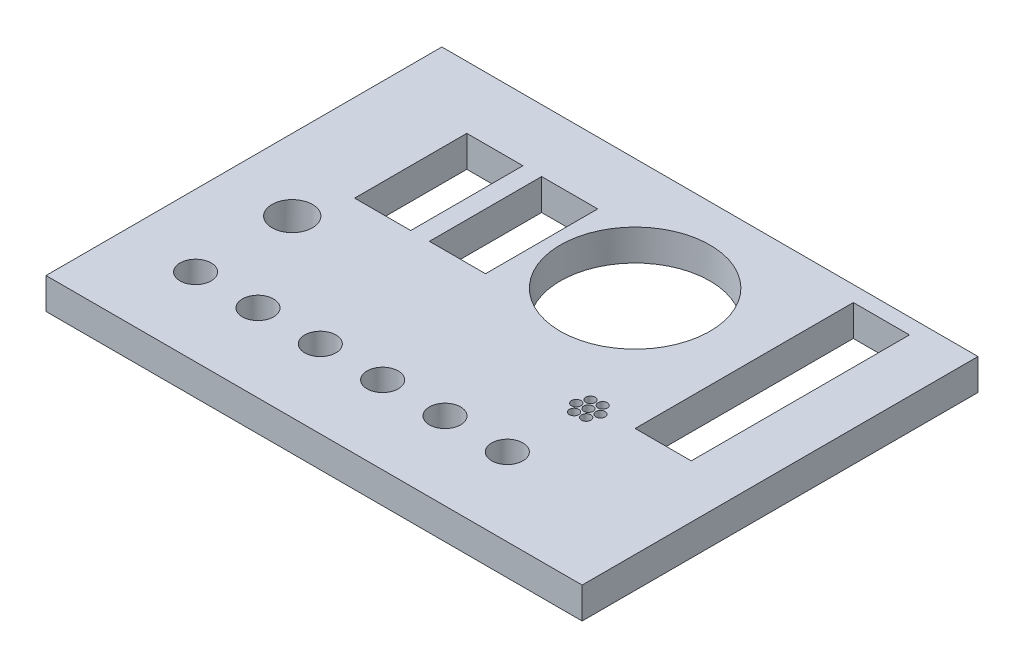
ISO-10303-21;
HEADER;
FILE_DESCRIPTION(('STEP AP214'),'2;1');
FILE_NAME('part.step','',(''),(''),'','','');
FILE_SCHEMA(('AUTOMOTIVE_DESIGN { 1 0 10303 214 1 1 1 1 }'));
ENDSEC;
DATA;
#1=APPLICATION_CONTEXT('core data for automotive mechanical design processes');
#2=APPLICATION_PROTOCOL_DEFINITION('international standard','automotive_design',2000,#1);
#3=PRODUCT_CONTEXT('',#1,'mechanical');
#4=PRODUCT('Part','Part','',(#3));
#5=PRODUCT_RELATED_PRODUCT_CATEGORY('part','',(#4));
#6=PRODUCT_DEFINITION_FORMATION('','',#4);
#7=PRODUCT_DEFINITION_CONTEXT('part definition',#1,'design');
#8=PRODUCT_DEFINITION('design','',#6,#7);
#9=PRODUCT_DEFINITION_SHAPE('','',#8);
#10=(LENGTH_UNIT() NAMED_UNIT(*) SI_UNIT(.MILLI.,.METRE.));
#11=(NAMED_UNIT(*) PLANE_ANGLE_UNIT() SI_UNIT($,.RADIAN.));
#12=(NAMED_UNIT(*) SI_UNIT($,.STERADIAN.) SOLID_ANGLE_UNIT());
#13=UNCERTAINTY_MEASURE_WITH_UNIT(LENGTH_MEASURE(1.E-05),#10,'distance_accuracy_value','');
#14=(GEOMETRIC_REPRESENTATION_CONTEXT(3) GLOBAL_UNCERTAINTY_ASSIGNED_CONTEXT((#13)) GLOBAL_UNIT_ASSIGNED_CONTEXT((#10,
#11,#12)) REPRESENTATION_CONTEXT('',''));
#15=CARTESIAN_POINT('',(0.,0.,0.));
#16=DIRECTION('',(0.,0.,1.));
#17=DIRECTION('',(1.,0.,0.));
#18=AXIS2_PLACEMENT_3D('',#15,#16,#17);
#19=CARTESIAN_POINT('',(42.9999999999999,5.,31.75));
#20=DIRECTION('',(-1.,0.,0.));
#21=DIRECTION('',(0.,0.,1.));
#22=AXIS2_PLACEMENT_3D('',#19,#20,#21);
#23=PLANE('',#22);
#24=DIRECTION('',(0.,0.,-1.));
#25=VECTOR('',#24,1.);
#26=CARTESIAN_POINT('',(42.9999999999999,0.,31.75));
#27=LINE('',#26,#25);
#28=CARTESIAN_POINT('',(42.9999999999999,0.,31.75));
#29=VERTEX_POINT('',#28);
#30=CARTESIAN_POINT('',(42.9999999999999,0.,-31.75));
#31=VERTEX_POINT('',#30);
#32=EDGE_CURVE('E291',#29,#31,#27,.T.);
#33=ORIENTED_EDGE('',*,*,#32,.T.);
#34=DIRECTION('',(0.,-1.,0.));
#35=VECTOR('',#34,1.);
#36=CARTESIAN_POINT('',(42.9999999999999,5.,-31.75));
#37=LINE('',#36,#35);
#38=CARTESIAN_POINT('',(42.9999999999999,5.,-31.75));
#39=VERTEX_POINT('',#38);
#40=EDGE_CURVE('E11',#39,#31,#37,.T.);
#41=ORIENTED_EDGE('',*,*,#40,.F.);
#42=DIRECTION('',(0.,0.,-1.));
#43=VECTOR('',#42,1.);
#44=CARTESIAN_POINT('',(42.9999999999999,5.,31.75));
#45=LINE('',#44,#43);
#46=CARTESIAN_POINT('',(42.9999999999999,5.,31.75));
#47=VERTEX_POINT('',#46);
#48=EDGE_CURVE('E294',#47,#39,#45,.T.);
#49=ORIENTED_EDGE('',*,*,#48,.F.);
#50=DIRECTION('',(0.,-1.,0.));
#51=VECTOR('',#50,1.);
#52=CARTESIAN_POINT('',(42.9999999999999,5.,31.75));
#53=LINE('',#52,#51);
#54=EDGE_CURVE('E304',#47,#29,#53,.T.);
#55=ORIENTED_EDGE('',*,*,#54,.T.);
#56=EDGE_LOOP('',(#33,#41,#49,#55));
#57=FACE_BOUND('',#56,.T.);
#58=ADVANCED_FACE('F36',(#57),#23,.F.);
#59=CARTESIAN_POINT('',(-43.,5.,-31.75));
#60=DIRECTION('',(0.,0.,1.));
#61=DIRECTION('',(1.,0.,0.));
#62=AXIS2_PLACEMENT_3D('',#59,#60,#61);
#63=PLANE('',#62);
#64=DIRECTION('',(-1.,0.,0.));
#65=VECTOR('',#64,1.);
#66=CARTESIAN_POINT('',(-43.,0.,-31.75));
#67=LINE('',#66,#65);
#68=CARTESIAN_POINT('',(-43.,0.,-31.75));
#69=VERTEX_POINT('',#68);
#70=EDGE_CURVE('E307',#31,#69,#67,.T.);
#71=ORIENTED_EDGE('',*,*,#70,.T.);
#72=DIRECTION('',(0.,-1.,0.));
#73=VECTOR('',#72,1.);
#74=CARTESIAN_POINT('',(-43.,5.,-31.75));
#75=LINE('',#74,#73);
#76=CARTESIAN_POINT('',(-43.,5.,-31.75));
#77=VERTEX_POINT('',#76);
#78=EDGE_CURVE('E43',#77,#69,#75,.T.);
#79=ORIENTED_EDGE('',*,*,#78,.F.);
#80=DIRECTION('',(-1.,0.,0.));
#81=VECTOR('',#80,1.);
#82=CARTESIAN_POINT('',(-43.,5.,-31.75));
#83=LINE('',#82,#81);
#84=EDGE_CURVE('E297',#39,#77,#83,.T.);
#85=ORIENTED_EDGE('',*,*,#84,.F.);
#86=ORIENTED_EDGE('',*,*,#40,.T.);
#87=EDGE_LOOP('',(#71,#79,#85,#86));
#88=FACE_BOUND('',#87,.T.);
#89=ADVANCED_FACE('F336',(#88),#63,.F.);
#90=CARTESIAN_POINT('',(-43.,5.,31.75));
#91=DIRECTION('',(1.,0.,0.));
#92=DIRECTION('',(0.,0.,-1.));
#93=AXIS2_PLACEMENT_3D('',#90,#91,#92);
#94=PLANE('',#93);
#95=DIRECTION('',(0.,0.,1.));
#96=VECTOR('',#95,1.);
#97=CARTESIAN_POINT('',(-43.,0.,31.75));
#98=LINE('',#97,#96);
#99=CARTESIAN_POINT('',(-43.,0.,31.75));
#100=VERTEX_POINT('',#99);
#101=EDGE_CURVE('E309',#69,#100,#98,.T.);
#102=ORIENTED_EDGE('',*,*,#101,.T.);
#103=DIRECTION('',(0.,-1.,0.));
#104=VECTOR('',#103,1.);
#105=CARTESIAN_POINT('',(-43.,5.,31.75));
#106=LINE('',#105,#104);
#107=CARTESIAN_POINT('',(-43.,5.,31.75));
#108=VERTEX_POINT('',#107);
#109=EDGE_CURVE('E314',#108,#100,#106,.T.);
#110=ORIENTED_EDGE('',*,*,#109,.F.);
#111=DIRECTION('',(0.,0.,1.));
#112=VECTOR('',#111,1.);
#113=CARTESIAN_POINT('',(-43.,5.,31.75));
#114=LINE('',#113,#112);
#115=EDGE_CURVE('E300',#77,#108,#114,.T.);
#116=ORIENTED_EDGE('',*,*,#115,.F.);
#117=ORIENTED_EDGE('',*,*,#78,.T.);
#118=EDGE_LOOP('',(#102,#110,#116,#117));
#119=FACE_BOUND('',#118,.T.);
#120=ADVANCED_FACE('F321',(#119),#94,.F.);
#121=CARTESIAN_POINT('',(-43.,5.,31.75));
#122=DIRECTION('',(0.,0.,-1.));
#123=DIRECTION('',(-1.,0.,0.));
#124=AXIS2_PLACEMENT_3D('',#121,#122,#123);
#125=PLANE('',#124);
#126=DIRECTION('',(1.,0.,0.));
#127=VECTOR('',#126,1.);
#128=CARTESIAN_POINT('',(-43.,0.,31.75));
#129=LINE('',#128,#127);
#130=EDGE_CURVE('E298',#100,#29,#129,.T.);
#131=ORIENTED_EDGE('',*,*,#130,.T.);
#132=ORIENTED_EDGE('',*,*,#54,.F.);
#133=DIRECTION('',(1.,0.,0.));
#134=VECTOR('',#133,1.);
#135=CARTESIAN_POINT('',(-43.,5.,31.75));
#136=LINE('',#135,#134);
#137=EDGE_CURVE('E302',#108,#47,#136,.T.);
#138=ORIENTED_EDGE('',*,*,#137,.F.);
#139=ORIENTED_EDGE('',*,*,#109,.T.);
#140=EDGE_LOOP('',(#131,#132,#138,#139));
#141=FACE_BOUND('',#140,.T.);
#142=ADVANCED_FACE('F329',(#141),#125,.F.);
#143=CARTESIAN_POINT('',(0.,5.,0.));
#144=DIRECTION('',(0.,-1.,0.));
#145=DIRECTION('',(0.,0.,-1.));
#146=AXIS2_PLACEMENT_3D('',#143,#144,#145);
#147=PLANE('',#146);
#148=CARTESIAN_POINT('',(18.9999999999999,5.,6.75));
#149=DIRECTION('',(0.,1.,0.));
#150=DIRECTION('',(0.,0.,1.));
#151=AXIS2_PLACEMENT_3D('',#148,#149,#150);
#152=CIRCLE('',#151,0.750000000000002);
#153=CARTESIAN_POINT('',(18.9999999999999,5.,7.5));
#154=VERTEX_POINT('',#153);
#155=EDGE_CURVE('E498',#154,#154,#152,.T.);
#156=ORIENTED_EDGE('',*,*,#155,.F.);
#157=EDGE_LOOP('',(#156));
#158=FACE_BOUND('',#157,.T.);
#159=CARTESIAN_POINT('',(17.9487584314246,5.,5.35093203721194));
#160=DIRECTION('',(0.,1.,0.));
#161=DIRECTION('',(0.,0.,1.));
#162=AXIS2_PLACEMENT_3D('',#159,#160,#161);
#163=CIRCLE('',#162,0.750000000000006);
#164=CARTESIAN_POINT('',(17.9487584314246,5.,6.10093203721195));
#165=VERTEX_POINT('',#164);
#166=EDGE_CURVE('E492',#165,#165,#163,.T.);
#167=ORIENTED_EDGE('',*,*,#166,.F.);
#168=EDGE_LOOP('',(#167));
#169=FACE_BOUND('',#168,.T.);
#170=DIRECTION('',(-1.,0.,0.));
#171=VECTOR('',#170,1.);
#172=CARTESIAN_POINT('',(34.4999999999999,5.,-29.25));
#173=LINE('',#172,#171);
#174=CARTESIAN_POINT('',(34.4999999999999,5.,-29.25));
#175=VERTEX_POINT('',#174);
#176=CARTESIAN_POINT('',(25.4999999999999,5.,-29.25));
#177=VERTEX_POINT('',#176);
#178=EDGE_CURVE('E172',#175,#177,#173,.T.);
#179=ORIENTED_EDGE('',*,*,#178,.F.);
#180=DIRECTION('',(0.,0.,-1.));
#181=VECTOR('',#180,1.);
#182=CARTESIAN_POINT('',(34.4999999999999,5.,-29.25));
#183=LINE('',#182,#181);
#184=CARTESIAN_POINT('',(34.4999999999999,5.,5.75));
#185=VERTEX_POINT('',#184);
#186=EDGE_CURVE('E50',#185,#175,#183,.T.);
#187=ORIENTED_EDGE('',*,*,#186,.F.);
#188=DIRECTION('',(1.,0.,0.));
#189=VECTOR('',#188,1.);
#190=CARTESIAN_POINT('',(34.4999999999999,5.,5.75));
#191=LINE('',#190,#189);
#192=CARTESIAN_POINT('',(25.4999999999999,5.,5.75));
#193=VERTEX_POINT('',#192);
#194=EDGE_CURVE('E165',#193,#185,#191,.T.);
#195=ORIENTED_EDGE('',*,*,#194,.F.);
#196=DIRECTION('',(0.,0.,1.));
#197=VECTOR('',#196,1.);
#198=CARTESIAN_POINT('',(25.4999999999999,5.,-29.25));
#199=LINE('',#198,#197);
#200=EDGE_CURVE('E179',#177,#193,#199,.T.);
#201=ORIENTED_EDGE('',*,*,#200,.F.);
#202=EDGE_LOOP('',(#179,#187,#195,#201));
#203=FACE_BOUND('',#202,.T.);
#204=CARTESIAN_POINT('',(5.99999999999997,5.,-13.75));
#205=DIRECTION('',(0.,1.,0.));
#206=DIRECTION('',(0.,0.,1.));
#207=AXIS2_PLACEMENT_3D('',#204,#205,#206);
#208=CIRCLE('',#207,12.);
#209=CARTESIAN_POINT('',(5.99999999999997,5.,-1.75));
#210=VERTEX_POINT('',#209);
#211=EDGE_CURVE('E236',#210,#210,#208,.T.);
#212=ORIENTED_EDGE('',*,*,#211,.F.);
#213=EDGE_LOOP('',(#212));
#214=FACE_BOUND('',#213,.T.);
#215=CARTESIAN_POINT('',(20.7372491183109,5.,6.53913208518538));
#216=DIRECTION('',(0.,1.,0.));
#217=DIRECTION('',(0.,0.,1.));
#218=AXIS2_PLACEMENT_3D('',#215,#216,#217);
#219=CIRCLE('',#218,0.750000000000006);
#220=CARTESIAN_POINT('',(20.7372491183109,5.,7.28913208518538));
#221=VERTEX_POINT('',#220);
#222=EDGE_CURVE('E471',#221,#221,#219,.T.);
#223=ORIENTED_EDGE('',*,*,#222,.F.);
#224=EDGE_LOOP('',(#223));
#225=FACE_BOUND('',#224,.T.);
#226=CARTESIAN_POINT('',(19.686007583642,5.,5.14006413684537));
#227=DIRECTION('',(0.,1.,0.));
#228=DIRECTION('',(0.,0.,1.));
#229=AXIS2_PLACEMENT_3D('',#226,#227,#228);
#230=CIRCLE('',#229,0.750000000000006);
#231=CARTESIAN_POINT('',(19.686007583642,5.,5.89006413684537));
#232=VERTEX_POINT('',#231);
#233=EDGE_CURVE('E479',#232,#232,#230,.T.);
#234=ORIENTED_EDGE('',*,*,#233,.F.);
#235=EDGE_LOOP('',(#234));
#236=FACE_BOUND('',#235,.T.);
#237=CARTESIAN_POINT('',(20.0512415007622,5.,8.14906793389195));
#238=DIRECTION('',(0.,1.,0.));
#239=DIRECTION('',(0.,0.,1.));
#240=AXIS2_PLACEMENT_3D('',#237,#238,#239);
#241=CIRCLE('',#240,0.750000000000005);
#242=CARTESIAN_POINT('',(20.0512415007622,5.,8.89906793389196));
#243=VERTEX_POINT('',#242);
#244=EDGE_CURVE('E478',#243,#243,#241,.T.);
#245=ORIENTED_EDGE('',*,*,#244,.F.);
#246=EDGE_LOOP('',(#245));
#247=FACE_BOUND('',#246,.T.);
#248=CARTESIAN_POINT('',(18.3139923485448,5.,8.35993583425851));
#249=DIRECTION('',(0.,1.,0.));
#250=DIRECTION('',(0.,0.,1.));
#251=AXIS2_PLACEMENT_3D('',#248,#249,#250);
#252=CIRCLE('',#251,0.750000000000005);
#253=CARTESIAN_POINT('',(18.3139923485448,5.,9.10993583425852));
#254=VERTEX_POINT('',#253);
#255=EDGE_CURVE('E467',#254,#254,#252,.T.);
#256=ORIENTED_EDGE('',*,*,#255,.F.);
#257=EDGE_LOOP('',(#256));
#258=FACE_BOUND('',#257,.T.);
#259=CARTESIAN_POINT('',(-21.5,5.,19.25));
#260=DIRECTION('',(0.,1.,0.));
#261=DIRECTION('',(0.,0.,1.));
#262=AXIS2_PLACEMENT_3D('',#259,#260,#261);
#263=CIRCLE('',#262,2.5);
#264=CARTESIAN_POINT('',(-21.5,5.,21.75));
#265=VERTEX_POINT('',#264);
#266=EDGE_CURVE('E264',#265,#265,#263,.T.);
#267=ORIENTED_EDGE('',*,*,#266,.F.);
#268=EDGE_LOOP('',(#267));
#269=FACE_BOUND('',#268,.T.);
#270=CARTESIAN_POINT('',(-11.5,5.,19.25));
#271=DIRECTION('',(0.,1.,0.));
#272=DIRECTION('',(0.,0.,1.));
#273=AXIS2_PLACEMENT_3D('',#270,#271,#272);
#274=CIRCLE('',#273,2.5);
#275=CARTESIAN_POINT('',(-11.5,5.,21.75));
#276=VERTEX_POINT('',#275);
#277=EDGE_CURVE('E271',#276,#276,#274,.T.);
#278=ORIENTED_EDGE('',*,*,#277,.F.);
#279=EDGE_LOOP('',(#278));
#280=FACE_BOUND('',#279,.T.);
#281=CARTESIAN_POINT('',(-1.50000000000004,5.,19.25));
#282=DIRECTION('',(0.,1.,0.));
#283=DIRECTION('',(0.,0.,1.));
#284=AXIS2_PLACEMENT_3D('',#281,#282,#283);
#285=CIRCLE('',#284,2.5);
#286=CARTESIAN_POINT('',(-1.50000000000004,5.,21.75));
#287=VERTEX_POINT('',#286);
#288=EDGE_CURVE('E277',#287,#287,#285,.T.);
#289=ORIENTED_EDGE('',*,*,#288,.F.);
#290=EDGE_LOOP('',(#289));
#291=FACE_BOUND('',#290,.T.);
#292=CARTESIAN_POINT('',(8.49999999999996,5.,19.25));
#293=DIRECTION('',(0.,1.,0.));
#294=DIRECTION('',(0.,0.,1.));
#295=AXIS2_PLACEMENT_3D('',#292,#293,#294);
#296=CIRCLE('',#295,2.5);
#297=CARTESIAN_POINT('',(8.49999999999996,5.,21.75));
#298=VERTEX_POINT('',#297);
#299=EDGE_CURVE('E283',#298,#298,#296,.T.);
#300=ORIENTED_EDGE('',*,*,#299,.F.);
#301=EDGE_LOOP('',(#300));
#302=FACE_BOUND('',#301,.T.);
#303=CARTESIAN_POINT('',(18.5,5.,19.25));
#304=DIRECTION('',(0.,1.,0.));
#305=DIRECTION('',(0.,0.,1.));
#306=AXIS2_PLACEMENT_3D('',#303,#304,#305);
#307=CIRCLE('',#306,2.5);
#308=CARTESIAN_POINT('',(18.5,5.,21.75));
#309=VERTEX_POINT('',#308);
#310=EDGE_CURVE('E188',#309,#309,#307,.T.);
#311=ORIENTED_EDGE('',*,*,#310,.F.);
#312=EDGE_LOOP('',(#311));
#313=FACE_BOUND('',#312,.T.);
#314=CARTESIAN_POINT('',(-31.5,5.,3.75));
#315=DIRECTION('',(0.,1.,0.));
#316=DIRECTION('',(0.,0.,1.));
#317=AXIS2_PLACEMENT_3D('',#314,#315,#316);
#318=CIRCLE('',#317,3.25);
#319=CARTESIAN_POINT('',(-31.5,5.,7.));
#320=VERTEX_POINT('',#319);
#321=EDGE_CURVE('E195',#320,#320,#318,.T.);
#322=ORIENTED_EDGE('',*,*,#321,.F.);
#323=EDGE_LOOP('',(#322));
#324=FACE_BOUND('',#323,.T.);
#325=DIRECTION('',(1.,0.,0.));
#326=VECTOR('',#325,1.);
#327=CARTESIAN_POINT('',(-29.,5.,-3.75));
#328=LINE('',#327,#326);
#329=CARTESIAN_POINT('',(-29.,5.,-3.75));
#330=VERTEX_POINT('',#329);
#331=CARTESIAN_POINT('',(-20.,5.,-3.75));
#332=VERTEX_POINT('',#331);
#333=EDGE_CURVE('E213',#330,#332,#328,.T.);
#334=ORIENTED_EDGE('',*,*,#333,.F.);
#335=DIRECTION('',(0.,0.,1.));
#336=VECTOR('',#335,1.);
#337=CARTESIAN_POINT('',(-29.,5.,-21.75));
#338=LINE('',#337,#336);
#339=CARTESIAN_POINT('',(-29.,5.,-21.75));
#340=VERTEX_POINT('',#339);
#341=EDGE_CURVE('E58',#340,#330,#338,.T.);
#342=ORIENTED_EDGE('',*,*,#341,.F.);
#343=DIRECTION('',(-1.,0.,0.));
#344=VECTOR('',#343,1.);
#345=CARTESIAN_POINT('',(-29.,5.,-21.75));
#346=LINE('',#345,#344);
#347=CARTESIAN_POINT('',(-20.,5.,-21.75));
#348=VERTEX_POINT('',#347);
#349=EDGE_CURVE('E219',#348,#340,#346,.T.);
#350=ORIENTED_EDGE('',*,*,#349,.F.);
#351=DIRECTION('',(0.,0.,-1.));
#352=VECTOR('',#351,1.);
#353=CARTESIAN_POINT('',(-20.,5.,-21.75));
#354=LINE('',#353,#352);
#355=EDGE_CURVE('E216',#332,#348,#354,.T.);
#356=ORIENTED_EDGE('',*,*,#355,.F.);
#357=EDGE_LOOP('',(#334,#342,#350,#356));
#358=FACE_BOUND('',#357,.T.);
#359=DIRECTION('',(1.,0.,0.));
#360=VECTOR('',#359,1.);
#361=CARTESIAN_POINT('',(-17.,5.,-3.75));
#362=LINE('',#361,#360);
#363=CARTESIAN_POINT('',(-17.,5.,-3.75));
#364=VERTEX_POINT('',#363);
#365=CARTESIAN_POINT('',(-8.00000000000004,5.,-3.75));
#366=VERTEX_POINT('',#365);
#367=EDGE_CURVE('E244',#364,#366,#362,.T.);
#368=ORIENTED_EDGE('',*,*,#367,.F.);
#369=DIRECTION('',(0.,0.,1.));
#370=VECTOR('',#369,1.);
#371=CARTESIAN_POINT('',(-17.,5.,-21.75));
#372=LINE('',#371,#370);
#373=CARTESIAN_POINT('',(-17.,5.,-21.75));
#374=VERTEX_POINT('',#373);
#375=EDGE_CURVE('E242',#374,#364,#372,.T.);
#376=ORIENTED_EDGE('',*,*,#375,.F.);
#377=DIRECTION('',(-1.,0.,0.));
#378=VECTOR('',#377,1.);
#379=CARTESIAN_POINT('',(-17.,5.,-21.75));
#380=LINE('',#379,#378);
#381=CARTESIAN_POINT('',(-8.00000000000004,5.,-21.75));
#382=VERTEX_POINT('',#381);
#383=EDGE_CURVE('E250',#382,#374,#380,.T.);
#384=ORIENTED_EDGE('',*,*,#383,.F.);
#385=DIRECTION('',(0.,0.,-1.));
#386=VECTOR('',#385,1.);
#387=CARTESIAN_POINT('',(-8.00000000000004,5.,-21.75));
#388=LINE('',#387,#386);
#389=EDGE_CURVE('E247',#366,#382,#388,.T.);
#390=ORIENTED_EDGE('',*,*,#389,.F.);
#391=EDGE_LOOP('',(#368,#376,#384,#390));
#392=FACE_BOUND('',#391,.T.);
#393=CARTESIAN_POINT('',(17.262750813876,5.,6.96086788591851));
#394=DIRECTION('',(0.,1.,0.));
#395=DIRECTION('',(0.,0.,1.));
#396=AXIS2_PLACEMENT_3D('',#393,#394,#395);
#397=CIRCLE('',#396,0.750000000000006);
#398=CARTESIAN_POINT('',(17.262750813876,5.,7.71086788591851));
#399=VERTEX_POINT('',#398);
#400=EDGE_CURVE('E462',#399,#399,#397,.T.);
#401=ORIENTED_EDGE('',*,*,#400,.F.);
#402=EDGE_LOOP('',(#401));
#403=FACE_BOUND('',#402,.T.);
#404=CARTESIAN_POINT('',(-31.5,5.,19.25));
#405=DIRECTION('',(0.,1.,0.));
#406=DIRECTION('',(0.,0.,1.));
#407=AXIS2_PLACEMENT_3D('',#404,#405,#406);
#408=CIRCLE('',#407,2.5);
#409=CARTESIAN_POINT('',(-31.5,5.,21.75));
#410=VERTEX_POINT('',#409);
#411=EDGE_CURVE('E288',#410,#410,#408,.T.);
#412=ORIENTED_EDGE('',*,*,#411,.F.);
#413=EDGE_LOOP('',(#412));
#414=FACE_BOUND('',#413,.T.);
#415=ORIENTED_EDGE('',*,*,#48,.T.);
#416=ORIENTED_EDGE('',*,*,#84,.T.);
#417=ORIENTED_EDGE('',*,*,#115,.T.);
#418=ORIENTED_EDGE('',*,*,#137,.T.);
#419=EDGE_LOOP('',(#415,#416,#417,#418));
#420=FACE_BOUND('',#419,.T.);
#421=ADVANCED_FACE('F335',(#158,#169,#203,#214,#225,#236,#247,#258,#269,#280,#291,#302,#313,
#324,#358,#392,#403,#414,#420),#147,.F.);
#422=CARTESIAN_POINT('',(0.,0.,0.));
#423=DIRECTION('',(0.,-1.,0.));
#424=DIRECTION('',(0.,0.,-1.));
#425=AXIS2_PLACEMENT_3D('',#422,#423,#424);
#426=PLANE('',#425);
#427=CARTESIAN_POINT('',(18.9999999999999,0.,6.75));
#428=DIRECTION('',(0.,-1.,0.));
#429=DIRECTION('',(0.,0.,-1.));
#430=AXIS2_PLACEMENT_3D('',#427,#428,#429);
#431=CIRCLE('',#430,0.750000000000002);
#432=CARTESIAN_POINT('',(18.9999999999999,0.,6.));
#433=VERTEX_POINT('',#432);
#434=EDGE_CURVE('E495',#433,#433,#431,.F.);
#435=ORIENTED_EDGE('',*,*,#434,.T.);
#436=EDGE_LOOP('',(#435));
#437=FACE_BOUND('',#436,.T.);
#438=CARTESIAN_POINT('',(17.9487584314246,0.,5.35093203721194));
#439=DIRECTION('',(0.,-1.,0.));
#440=DIRECTION('',(0.,0.,-1.));
#441=AXIS2_PLACEMENT_3D('',#438,#439,#440);
#442=CIRCLE('',#441,0.750000000000006);
#443=CARTESIAN_POINT('',(17.9487584314246,0.,4.60093203721193));
#444=VERTEX_POINT('',#443);
#445=EDGE_CURVE('E482',#444,#444,#442,.F.);
#446=ORIENTED_EDGE('',*,*,#445,.T.);
#447=EDGE_LOOP('',(#446));
#448=FACE_BOUND('',#447,.T.);
#449=DIRECTION('',(0.,0.,-1.));
#450=VECTOR('',#449,1.);
#451=CARTESIAN_POINT('',(34.4999999999999,0.,-29.25));
#452=LINE('',#451,#450);
#453=CARTESIAN_POINT('',(34.4999999999999,0.,5.75));
#454=VERTEX_POINT('',#453);
#455=CARTESIAN_POINT('',(34.4999999999999,0.,-29.25));
#456=VERTEX_POINT('',#455);
#457=EDGE_CURVE('E163',#454,#456,#452,.T.);
#458=ORIENTED_EDGE('',*,*,#457,.T.);
#459=DIRECTION('',(-1.,0.,0.));
#460=VECTOR('',#459,1.);
#461=CARTESIAN_POINT('',(34.4999999999999,0.,-29.25));
#462=LINE('',#461,#460);
#463=CARTESIAN_POINT('',(25.4999999999999,0.,-29.25));
#464=VERTEX_POINT('',#463);
#465=EDGE_CURVE('E149',#456,#464,#462,.T.);
#466=ORIENTED_EDGE('',*,*,#465,.T.);
#467=DIRECTION('',(0.,0.,1.));
#468=VECTOR('',#467,1.);
#469=CARTESIAN_POINT('',(25.4999999999999,0.,-29.25));
#470=LINE('',#469,#468);
#471=CARTESIAN_POINT('',(25.4999999999999,0.,5.75));
#472=VERTEX_POINT('',#471);
#473=EDGE_CURVE('E174',#464,#472,#470,.T.);
#474=ORIENTED_EDGE('',*,*,#473,.T.);
#475=DIRECTION('',(1.,0.,0.));
#476=VECTOR('',#475,1.);
#477=CARTESIAN_POINT('',(34.4999999999999,0.,5.75));
#478=LINE('',#477,#476);
#479=EDGE_CURVE('E170',#472,#454,#478,.T.);
#480=ORIENTED_EDGE('',*,*,#479,.T.);
#481=EDGE_LOOP('',(#458,#466,#474,#480));
#482=FACE_BOUND('',#481,.T.);
#483=CARTESIAN_POINT('',(5.99999999999997,0.,-13.75));
#484=DIRECTION('',(0.,-1.,0.));
#485=DIRECTION('',(0.,0.,-1.));
#486=AXIS2_PLACEMENT_3D('',#483,#484,#485);
#487=CIRCLE('',#486,12.);
#488=CARTESIAN_POINT('',(5.99999999999997,0.,-25.75));
#489=VERTEX_POINT('',#488);
#490=EDGE_CURVE('E159',#489,#489,#487,.F.);
#491=ORIENTED_EDGE('',*,*,#490,.T.);
#492=EDGE_LOOP('',(#491));
#493=FACE_BOUND('',#492,.T.);
#494=CARTESIAN_POINT('',(20.7372491183109,0.,6.53913208518538));
#495=DIRECTION('',(0.,-1.,0.));
#496=DIRECTION('',(0.,0.,-1.));
#497=AXIS2_PLACEMENT_3D('',#494,#495,#496);
#498=CIRCLE('',#497,0.750000000000006);
#499=CARTESIAN_POINT('',(20.7372491183109,0.,5.78913208518537));
#500=VERTEX_POINT('',#499);
#501=EDGE_CURVE('E475',#500,#500,#498,.F.);
#502=ORIENTED_EDGE('',*,*,#501,.T.);
#503=EDGE_LOOP('',(#502));
#504=FACE_BOUND('',#503,.T.);
#505=CARTESIAN_POINT('',(19.686007583642,0.,5.14006413684537));
#506=DIRECTION('',(0.,-1.,0.));
#507=DIRECTION('',(0.,0.,-1.));
#508=AXIS2_PLACEMENT_3D('',#505,#506,#507);
#509=CIRCLE('',#508,0.750000000000006);
#510=CARTESIAN_POINT('',(19.686007583642,0.,4.39006413684536));
#511=VERTEX_POINT('',#510);
#512=EDGE_CURVE('E474',#511,#511,#509,.F.);
#513=ORIENTED_EDGE('',*,*,#512,.T.);
#514=EDGE_LOOP('',(#513));
#515=FACE_BOUND('',#514,.T.);
#516=CARTESIAN_POINT('',(20.0512415007622,0.,8.14906793389195));
#517=DIRECTION('',(0.,-1.,0.));
#518=DIRECTION('',(0.,0.,-1.));
#519=AXIS2_PLACEMENT_3D('',#516,#517,#518);
#520=CIRCLE('',#519,0.750000000000005);
#521=CARTESIAN_POINT('',(20.0512415007622,0.,7.39906793389195));
#522=VERTEX_POINT('',#521);
#523=EDGE_CURVE('E487',#522,#522,#520,.F.);
#524=ORIENTED_EDGE('',*,*,#523,.T.);
#525=EDGE_LOOP('',(#524));
#526=FACE_BOUND('',#525,.T.);
#527=CARTESIAN_POINT('',(18.3139923485448,0.,8.35993583425851));
#528=DIRECTION('',(0.,-1.,0.));
#529=DIRECTION('',(0.,0.,-1.));
#530=AXIS2_PLACEMENT_3D('',#527,#528,#529);
#531=CIRCLE('',#530,0.750000000000005);
#532=CARTESIAN_POINT('',(18.3139923485448,0.,7.60993583425851));
#533=VERTEX_POINT('',#532);
#534=EDGE_CURVE('E464',#533,#533,#531,.F.);
#535=ORIENTED_EDGE('',*,*,#534,.T.);
#536=EDGE_LOOP('',(#535));
#537=FACE_BOUND('',#536,.T.);
#538=CARTESIAN_POINT('',(-21.5,0.,19.25));
#539=DIRECTION('',(0.,-1.,0.));
#540=DIRECTION('',(0.,0.,-1.));
#541=AXIS2_PLACEMENT_3D('',#538,#539,#540);
#542=CIRCLE('',#541,2.5);
#543=CARTESIAN_POINT('',(-21.5,0.,16.75));
#544=VERTEX_POINT('',#543);
#545=EDGE_CURVE('E268',#544,#544,#542,.F.);
#546=ORIENTED_EDGE('',*,*,#545,.T.);
#547=EDGE_LOOP('',(#546));
#548=FACE_BOUND('',#547,.T.);
#549=CARTESIAN_POINT('',(-11.5,0.,19.25));
#550=DIRECTION('',(0.,-1.,0.));
#551=DIRECTION('',(0.,0.,-1.));
#552=AXIS2_PLACEMENT_3D('',#549,#550,#551);
#553=CIRCLE('',#552,2.5);
#554=CARTESIAN_POINT('',(-11.5,0.,16.75));
#555=VERTEX_POINT('',#554);
#556=EDGE_CURVE('E274',#555,#555,#553,.F.);
#557=ORIENTED_EDGE('',*,*,#556,.T.);
#558=EDGE_LOOP('',(#557));
#559=FACE_BOUND('',#558,.T.);
#560=CARTESIAN_POINT('',(-1.50000000000004,0.,19.25));
#561=DIRECTION('',(0.,-1.,0.));
#562=DIRECTION('',(0.,0.,-1.));
#563=AXIS2_PLACEMENT_3D('',#560,#561,#562);
#564=CIRCLE('',#563,2.5);
#565=CARTESIAN_POINT('',(-1.50000000000004,0.,16.75));
#566=VERTEX_POINT('',#565);
#567=EDGE_CURVE('E280',#566,#566,#564,.F.);
#568=ORIENTED_EDGE('',*,*,#567,.T.);
#569=EDGE_LOOP('',(#568));
#570=FACE_BOUND('',#569,.T.);
#571=CARTESIAN_POINT('',(8.49999999999996,0.,19.25));
#572=DIRECTION('',(0.,-1.,0.));
#573=DIRECTION('',(0.,0.,-1.));
#574=AXIS2_PLACEMENT_3D('',#571,#572,#573);
#575=CIRCLE('',#574,2.5);
#576=CARTESIAN_POINT('',(8.49999999999996,0.,16.75));
#577=VERTEX_POINT('',#576);
#578=EDGE_CURVE('E191',#577,#577,#575,.F.);
#579=ORIENTED_EDGE('',*,*,#578,.T.);
#580=EDGE_LOOP('',(#579));
#581=FACE_BOUND('',#580,.T.);
#582=CARTESIAN_POINT('',(18.5,0.,19.25));
#583=DIRECTION('',(0.,-1.,0.));
#584=DIRECTION('',(0.,0.,-1.));
#585=AXIS2_PLACEMENT_3D('',#582,#583,#584);
#586=CIRCLE('',#585,2.5);
#587=CARTESIAN_POINT('',(18.5,0.,16.75));
#588=VERTEX_POINT('',#587);
#589=EDGE_CURVE('E192',#588,#588,#586,.F.);
#590=ORIENTED_EDGE('',*,*,#589,.T.);
#591=EDGE_LOOP('',(#590));
#592=FACE_BOUND('',#591,.T.);
#593=CARTESIAN_POINT('',(-31.5,0.,3.75));
#594=DIRECTION('',(0.,-1.,0.));
#595=DIRECTION('',(0.,0.,-1.));
#596=AXIS2_PLACEMENT_3D('',#593,#594,#595);
#597=CIRCLE('',#596,3.25);
#598=CARTESIAN_POINT('',(-31.5,0.,0.5));
#599=VERTEX_POINT('',#598);
#600=EDGE_CURVE('E198',#599,#599,#597,.F.);
#601=ORIENTED_EDGE('',*,*,#600,.T.);
#602=EDGE_LOOP('',(#601));
#603=FACE_BOUND('',#602,.T.);
#604=DIRECTION('',(0.,0.,1.));
#605=VECTOR('',#604,1.);
#606=CARTESIAN_POINT('',(-29.,0.,-21.75));
#607=LINE('',#606,#605);
#608=CARTESIAN_POINT('',(-29.,0.,-21.75));
#609=VERTEX_POINT('',#608);
#610=CARTESIAN_POINT('',(-29.,0.,-3.75));
#611=VERTEX_POINT('',#610);
#612=EDGE_CURVE('E209',#609,#611,#607,.T.);
#613=ORIENTED_EDGE('',*,*,#612,.T.);
#614=DIRECTION('',(1.,0.,0.));
#615=VECTOR('',#614,1.);
#616=CARTESIAN_POINT('',(-29.,0.,-3.75));
#617=LINE('',#616,#615);
#618=CARTESIAN_POINT('',(-20.,0.,-3.75));
#619=VERTEX_POINT('',#618);
#620=EDGE_CURVE('E201',#611,#619,#617,.T.);
#621=ORIENTED_EDGE('',*,*,#620,.T.);
#622=DIRECTION('',(0.,0.,-1.));
#623=VECTOR('',#622,1.);
#624=CARTESIAN_POINT('',(-20.,0.,-21.75));
#625=LINE('',#624,#623);
#626=CARTESIAN_POINT('',(-20.,0.,-21.75));
#627=VERTEX_POINT('',#626);
#628=EDGE_CURVE('E202',#619,#627,#625,.T.);
#629=ORIENTED_EDGE('',*,*,#628,.T.);
#630=DIRECTION('',(-1.,0.,0.));
#631=VECTOR('',#630,1.);
#632=CARTESIAN_POINT('',(-29.,0.,-21.75));
#633=LINE('',#632,#631);
#634=EDGE_CURVE('E205',#627,#609,#633,.T.);
#635=ORIENTED_EDGE('',*,*,#634,.T.);
#636=EDGE_LOOP('',(#613,#621,#629,#635));
#637=FACE_BOUND('',#636,.T.);
#638=DIRECTION('',(0.,0.,1.));
#639=VECTOR('',#638,1.);
#640=CARTESIAN_POINT('',(-17.,0.,-21.75));
#641=LINE('',#640,#639);
#642=CARTESIAN_POINT('',(-17.,0.,-21.75));
#643=VERTEX_POINT('',#642);
#644=CARTESIAN_POINT('',(-17.,0.,-3.75));
#645=VERTEX_POINT('',#644);
#646=EDGE_CURVE('E239',#643,#645,#641,.T.);
#647=ORIENTED_EDGE('',*,*,#646,.T.);
#648=DIRECTION('',(1.,0.,0.));
#649=VECTOR('',#648,1.);
#650=CARTESIAN_POINT('',(-17.,0.,-3.75));
#651=LINE('',#650,#649);
#652=CARTESIAN_POINT('',(-8.00000000000004,0.,-3.75));
#653=VERTEX_POINT('',#652);
#654=EDGE_CURVE('E206',#645,#653,#651,.T.);
#655=ORIENTED_EDGE('',*,*,#654,.T.);
#656=DIRECTION('',(0.,0.,-1.));
#657=VECTOR('',#656,1.);
#658=CARTESIAN_POINT('',(-8.00000000000004,0.,-21.75));
#659=LINE('',#658,#657);
#660=CARTESIAN_POINT('',(-8.00000000000004,0.,-21.75));
#661=VERTEX_POINT('',#660);
#662=EDGE_CURVE('E232',#653,#661,#659,.T.);
#663=ORIENTED_EDGE('',*,*,#662,.T.);
#664=DIRECTION('',(-1.,0.,0.));
#665=VECTOR('',#664,1.);
#666=CARTESIAN_POINT('',(-17.,0.,-21.75));
#667=LINE('',#666,#665);
#668=EDGE_CURVE('E235',#661,#643,#667,.T.);
#669=ORIENTED_EDGE('',*,*,#668,.T.);
#670=EDGE_LOOP('',(#647,#655,#663,#669));
#671=FACE_BOUND('',#670,.T.);
#672=CARTESIAN_POINT('',(17.262750813876,0.,6.96086788591851));
#673=DIRECTION('',(0.,-1.,0.));
#674=DIRECTION('',(0.,0.,-1.));
#675=AXIS2_PLACEMENT_3D('',#672,#673,#674);
#676=CIRCLE('',#675,0.750000000000006);
#677=CARTESIAN_POINT('',(17.262750813876,0.,6.2108678859185));
#678=VERTEX_POINT('',#677);
#679=EDGE_CURVE('E459',#678,#678,#676,.F.);
#680=ORIENTED_EDGE('',*,*,#679,.T.);
#681=EDGE_LOOP('',(#680));
#682=FACE_BOUND('',#681,.T.);
#683=CARTESIAN_POINT('',(-31.5,0.,19.25));
#684=DIRECTION('',(0.,-1.,0.));
#685=DIRECTION('',(0.,0.,-1.));
#686=AXIS2_PLACEMENT_3D('',#683,#684,#685);
#687=CIRCLE('',#686,2.5);
#688=CARTESIAN_POINT('',(-31.5,0.,16.75));
#689=VERTEX_POINT('',#688);
#690=EDGE_CURVE('E267',#689,#689,#687,.F.);
#691=ORIENTED_EDGE('',*,*,#690,.T.);
#692=EDGE_LOOP('',(#691));
#693=FACE_BOUND('',#692,.T.);
#694=ORIENTED_EDGE('',*,*,#32,.F.);
#695=ORIENTED_EDGE('',*,*,#130,.F.);
#696=ORIENTED_EDGE('',*,*,#101,.F.);
#697=ORIENTED_EDGE('',*,*,#70,.F.);
#698=EDGE_LOOP('',(#694,#695,#696,#697));
#699=FACE_BOUND('',#698,.T.);
#700=ADVANCED_FACE('F168',(#437,#448,#482,#493,#504,#515,#526,#537,#548,#559,#570,#581,#592,
#603,#637,#671,#682,#693,#699),#426,.T.);
#701=CARTESIAN_POINT('',(-31.5,-0.00100000000000013,19.25));
#702=DIRECTION('',(0.,1.,0.));
#703=DIRECTION('',(0.,0.,1.));
#704=AXIS2_PLACEMENT_3D('',#701,#702,#703);
#705=CYLINDRICAL_SURFACE('',#704,2.5);
#706=ORIENTED_EDGE('',*,*,#690,.F.);
#707=EDGE_LOOP('',(#706));
#708=FACE_BOUND('',#707,.T.);
#709=ORIENTED_EDGE('',*,*,#411,.T.);
#710=EDGE_LOOP('',(#709));
#711=FACE_BOUND('',#710,.T.);
#712=ADVANCED_FACE('F348',(#708,#711),#705,.F.);
#713=CARTESIAN_POINT('',(17.262750813876,-0.00100000000000013,6.96086788591851));
#714=DIRECTION('',(0.,1.,0.));
#715=DIRECTION('',(0.,0.,1.));
#716=AXIS2_PLACEMENT_3D('',#713,#714,#715);
#717=CYLINDRICAL_SURFACE('',#716,0.750000000000006);
#718=ORIENTED_EDGE('',*,*,#679,.F.);
#719=EDGE_LOOP('',(#718));
#720=FACE_BOUND('',#719,.T.);
#721=ORIENTED_EDGE('',*,*,#400,.T.);
#722=EDGE_LOOP('',(#721));
#723=FACE_BOUND('',#722,.T.);
#724=ADVANCED_FACE('F355',(#720,#723),#717,.F.);
#725=CARTESIAN_POINT('',(-17.,-0.00100000000000013,-21.75));
#726=DIRECTION('',(-1.,0.,0.));
#727=DIRECTION('',(0.,0.,1.));
#728=AXIS2_PLACEMENT_3D('',#725,#726,#727);
#729=PLANE('',#728);
#730=DIRECTION('',(0.,1.,0.));
#731=VECTOR('',#730,1.);
#732=CARTESIAN_POINT('',(-17.,-0.00100000000000013,-21.75));
#733=LINE('',#732,#731);
#734=EDGE_CURVE('E254',#643,#374,#733,.T.);
#735=ORIENTED_EDGE('',*,*,#734,.T.);
#736=ORIENTED_EDGE('',*,*,#375,.T.);
#737=DIRECTION('',(0.,1.,0.));
#738=VECTOR('',#737,1.);
#739=CARTESIAN_POINT('',(-17.,-0.00100000000000013,-3.75));
#740=LINE('',#739,#738);
#741=EDGE_CURVE('E253',#645,#364,#740,.T.);
#742=ORIENTED_EDGE('',*,*,#741,.F.);
#743=ORIENTED_EDGE('',*,*,#646,.F.);
#744=EDGE_LOOP('',(#735,#736,#742,#743));
#745=FACE_BOUND('',#744,.T.);
#746=ADVANCED_FACE('F375',(#745),#729,.F.);
#747=CARTESIAN_POINT('',(-17.,-0.00100000000000013,-21.75));
#748=DIRECTION('',(0.,0.,-1.));
#749=DIRECTION('',(-1.,0.,0.));
#750=AXIS2_PLACEMENT_3D('',#747,#748,#749);
#751=PLANE('',#750);
#752=DIRECTION('',(0.,1.,0.));
#753=VECTOR('',#752,1.);
#754=CARTESIAN_POINT('',(-8.00000000000004,-0.00100000000000013,-21.75));
#755=LINE('',#754,#753);
#756=EDGE_CURVE('E256',#661,#382,#755,.T.);
#757=ORIENTED_EDGE('',*,*,#756,.T.);
#758=ORIENTED_EDGE('',*,*,#383,.T.);
#759=ORIENTED_EDGE('',*,*,#734,.F.);
#760=ORIENTED_EDGE('',*,*,#668,.F.);
#761=EDGE_LOOP('',(#757,#758,#759,#760));
#762=FACE_BOUND('',#761,.T.);
#763=ADVANCED_FACE('F378',(#762),#751,.F.);
#764=CARTESIAN_POINT('',(-8.00000000000004,-0.00100000000000013,-21.75));
#765=DIRECTION('',(1.,0.,0.));
#766=DIRECTION('',(0.,0.,-1.));
#767=AXIS2_PLACEMENT_3D('',#764,#765,#766);
#768=PLANE('',#767);
#769=DIRECTION('',(0.,1.,0.));
#770=VECTOR('',#769,1.);
#771=CARTESIAN_POINT('',(-8.00000000000004,-0.00100000000000013,-3.75));
#772=LINE('',#771,#770);
#773=EDGE_CURVE('E258',#653,#366,#772,.T.);
#774=ORIENTED_EDGE('',*,*,#773,.T.);
#775=ORIENTED_EDGE('',*,*,#389,.T.);
#776=ORIENTED_EDGE('',*,*,#756,.F.);
#777=ORIENTED_EDGE('',*,*,#662,.F.);
#778=EDGE_LOOP('',(#774,#775,#776,#777));
#779=FACE_BOUND('',#778,.T.);
#780=ADVANCED_FACE('F384',(#779),#768,.F.);
#781=CARTESIAN_POINT('',(-17.,-0.00100000000000013,-3.75));
#782=DIRECTION('',(0.,0.,1.));
#783=DIRECTION('',(1.,0.,0.));
#784=AXIS2_PLACEMENT_3D('',#781,#782,#783);
#785=PLANE('',#784);
#786=ORIENTED_EDGE('',*,*,#741,.T.);
#787=ORIENTED_EDGE('',*,*,#367,.T.);
#788=ORIENTED_EDGE('',*,*,#773,.F.);
#789=ORIENTED_EDGE('',*,*,#654,.F.);
#790=EDGE_LOOP('',(#786,#787,#788,#789));
#791=FACE_BOUND('',#790,.T.);
#792=ADVANCED_FACE('F380',(#791),#785,.F.);
#793=CARTESIAN_POINT('',(-29.,-0.00100000000000013,-21.75));
#794=DIRECTION('',(-1.,0.,0.));
#795=DIRECTION('',(0.,0.,1.));
#796=AXIS2_PLACEMENT_3D('',#793,#794,#795);
#797=PLANE('',#796);
#798=DIRECTION('',(0.,1.,0.));
#799=VECTOR('',#798,1.);
#800=CARTESIAN_POINT('',(-29.,-0.00100000000000013,-21.75));
#801=LINE('',#800,#799);
#802=EDGE_CURVE('E223',#609,#340,#801,.T.);
#803=ORIENTED_EDGE('',*,*,#802,.T.);
#804=ORIENTED_EDGE('',*,*,#341,.T.);
#805=DIRECTION('',(0.,1.,0.));
#806=VECTOR('',#805,1.);
#807=CARTESIAN_POINT('',(-29.,-0.00100000000000013,-3.75));
#808=LINE('',#807,#806);
#809=EDGE_CURVE('E222',#611,#330,#808,.T.);
#810=ORIENTED_EDGE('',*,*,#809,.F.);
#811=ORIENTED_EDGE('',*,*,#612,.F.);
#812=EDGE_LOOP('',(#803,#804,#810,#811));
#813=FACE_BOUND('',#812,.T.);
#814=ADVANCED_FACE('F383',(#813),#797,.F.);
#815=CARTESIAN_POINT('',(-29.,-0.00100000000000013,-21.75));
#816=DIRECTION('',(0.,0.,-1.));
#817=DIRECTION('',(-1.,0.,0.));
#818=AXIS2_PLACEMENT_3D('',#815,#816,#817);
#819=PLANE('',#818);
#820=DIRECTION('',(0.,1.,0.));
#821=VECTOR('',#820,1.);
#822=CARTESIAN_POINT('',(-20.,-0.00100000000000013,-21.75));
#823=LINE('',#822,#821);
#824=EDGE_CURVE('E225',#627,#348,#823,.T.);
#825=ORIENTED_EDGE('',*,*,#824,.T.);
#826=ORIENTED_EDGE('',*,*,#349,.T.);
#827=ORIENTED_EDGE('',*,*,#802,.F.);
#828=ORIENTED_EDGE('',*,*,#634,.F.);
#829=EDGE_LOOP('',(#825,#826,#827,#828));
#830=FACE_BOUND('',#829,.T.);
#831=ADVANCED_FACE('F394',(#830),#819,.F.);
#832=CARTESIAN_POINT('',(-20.,-0.00100000000000013,-21.75));
#833=DIRECTION('',(1.,0.,0.));
#834=DIRECTION('',(0.,0.,-1.));
#835=AXIS2_PLACEMENT_3D('',#832,#833,#834);
#836=PLANE('',#835);
#837=DIRECTION('',(0.,1.,0.));
#838=VECTOR('',#837,1.);
#839=CARTESIAN_POINT('',(-20.,-0.00100000000000013,-3.75));
#840=LINE('',#839,#838);
#841=EDGE_CURVE('E227',#619,#332,#840,.T.);
#842=ORIENTED_EDGE('',*,*,#841,.T.);
#843=ORIENTED_EDGE('',*,*,#355,.T.);
#844=ORIENTED_EDGE('',*,*,#824,.F.);
#845=ORIENTED_EDGE('',*,*,#628,.F.);
#846=EDGE_LOOP('',(#842,#843,#844,#845));
#847=FACE_BOUND('',#846,.T.);
#848=ADVANCED_FACE('F399',(#847),#836,.F.);
#849=CARTESIAN_POINT('',(-29.,-0.00100000000000013,-3.75));
#850=DIRECTION('',(0.,0.,1.));
#851=DIRECTION('',(1.,0.,0.));
#852=AXIS2_PLACEMENT_3D('',#849,#850,#851);
#853=PLANE('',#852);
#854=ORIENTED_EDGE('',*,*,#809,.T.);
#855=ORIENTED_EDGE('',*,*,#333,.T.);
#856=ORIENTED_EDGE('',*,*,#841,.F.);
#857=ORIENTED_EDGE('',*,*,#620,.F.);
#858=EDGE_LOOP('',(#854,#855,#856,#857));
#859=FACE_BOUND('',#858,.T.);
#860=ADVANCED_FACE('F395',(#859),#853,.F.);
#861=CARTESIAN_POINT('',(-31.5,-0.00100000000000013,3.75));
#862=DIRECTION('',(0.,1.,0.));
#863=DIRECTION('',(0.,0.,1.));
#864=AXIS2_PLACEMENT_3D('',#861,#862,#863);
#865=CYLINDRICAL_SURFACE('',#864,3.25);
#866=ORIENTED_EDGE('',*,*,#600,.F.);
#867=EDGE_LOOP('',(#866));
#868=FACE_BOUND('',#867,.T.);
#869=ORIENTED_EDGE('',*,*,#321,.T.);
#870=EDGE_LOOP('',(#869));
#871=FACE_BOUND('',#870,.T.);
#872=ADVANCED_FACE('F398',(#868,#871),#865,.F.);
#873=CARTESIAN_POINT('',(18.5,-0.00100000000000013,19.25));
#874=DIRECTION('',(0.,1.,0.));
#875=DIRECTION('',(0.,0.,1.));
#876=AXIS2_PLACEMENT_3D('',#873,#874,#875);
#877=CYLINDRICAL_SURFACE('',#876,2.5);
#878=ORIENTED_EDGE('',*,*,#589,.F.);
#879=EDGE_LOOP('',(#878));
#880=FACE_BOUND('',#879,.T.);
#881=ORIENTED_EDGE('',*,*,#310,.T.);
#882=EDGE_LOOP('',(#881));
#883=FACE_BOUND('',#882,.T.);
#884=ADVANCED_FACE('F361',(#880,#883),#877,.F.);
#885=CARTESIAN_POINT('',(8.49999999999996,-0.00100000000000013,19.25));
#886=DIRECTION('',(0.,1.,0.));
#887=DIRECTION('',(0.,0.,1.));
#888=AXIS2_PLACEMENT_3D('',#885,#886,#887);
#889=CYLINDRICAL_SURFACE('',#888,2.5);
#890=ORIENTED_EDGE('',*,*,#578,.F.);
#891=EDGE_LOOP('',(#890));
#892=FACE_BOUND('',#891,.T.);
#893=ORIENTED_EDGE('',*,*,#299,.T.);
#894=EDGE_LOOP('',(#893));
#895=FACE_BOUND('',#894,.T.);
#896=ADVANCED_FACE('F357',(#892,#895),#889,.F.);
#897=CARTESIAN_POINT('',(-1.50000000000004,-0.00100000000000013,19.25));
#898=DIRECTION('',(0.,1.,0.));
#899=DIRECTION('',(0.,0.,1.));
#900=AXIS2_PLACEMENT_3D('',#897,#898,#899);
#901=CYLINDRICAL_SURFACE('',#900,2.5);
#902=ORIENTED_EDGE('',*,*,#567,.F.);
#903=EDGE_LOOP('',(#902));
#904=FACE_BOUND('',#903,.T.);
#905=ORIENTED_EDGE('',*,*,#288,.T.);
#906=EDGE_LOOP('',(#905));
#907=FACE_BOUND('',#906,.T.);
#908=ADVANCED_FACE('F360',(#904,#907),#901,.F.);
#909=CARTESIAN_POINT('',(-11.5,-0.00100000000000013,19.25));
#910=DIRECTION('',(0.,1.,0.));
#911=DIRECTION('',(0.,0.,1.));
#912=AXIS2_PLACEMENT_3D('',#909,#910,#911);
#913=CYLINDRICAL_SURFACE('',#912,2.5);
#914=ORIENTED_EDGE('',*,*,#556,.F.);
#915=EDGE_LOOP('',(#914));
#916=FACE_BOUND('',#915,.T.);
#917=ORIENTED_EDGE('',*,*,#277,.T.);
#918=EDGE_LOOP('',(#917));
#919=FACE_BOUND('',#918,.T.);
#920=ADVANCED_FACE('F365',(#916,#919),#913,.F.);
#921=CARTESIAN_POINT('',(-21.5,-0.00100000000000013,19.25));
#922=DIRECTION('',(0.,1.,0.));
#923=DIRECTION('',(0.,0.,1.));
#924=AXIS2_PLACEMENT_3D('',#921,#922,#923);
#925=CYLINDRICAL_SURFACE('',#924,2.5);
#926=ORIENTED_EDGE('',*,*,#545,.F.);
#927=EDGE_LOOP('',(#926));
#928=FACE_BOUND('',#927,.T.);
#929=ORIENTED_EDGE('',*,*,#266,.T.);
#930=EDGE_LOOP('',(#929));
#931=FACE_BOUND('',#930,.T.);
#932=ADVANCED_FACE('F369',(#928,#931),#925,.F.);
#933=CARTESIAN_POINT('',(18.3139923485448,-0.00100000000000013,8.35993583425851));
#934=DIRECTION('',(0.,1.,0.));
#935=DIRECTION('',(0.,0.,1.));
#936=AXIS2_PLACEMENT_3D('',#933,#934,#935);
#937=CYLINDRICAL_SURFACE('',#936,0.750000000000005);
#938=ORIENTED_EDGE('',*,*,#534,.F.);
#939=EDGE_LOOP('',(#938));
#940=FACE_BOUND('',#939,.T.);
#941=ORIENTED_EDGE('',*,*,#255,.T.);
#942=EDGE_LOOP('',(#941));
#943=FACE_BOUND('',#942,.T.);
#944=ADVANCED_FACE('F373',(#940,#943),#937,.F.);
#945=CARTESIAN_POINT('',(20.0512415007622,-0.00100000000000013,8.14906793389195));
#946=DIRECTION('',(0.,1.,0.));
#947=DIRECTION('',(0.,0.,1.));
#948=AXIS2_PLACEMENT_3D('',#945,#946,#947);
#949=CYLINDRICAL_SURFACE('',#948,0.750000000000005);
#950=ORIENTED_EDGE('',*,*,#523,.F.);
#951=EDGE_LOOP('',(#950));
#952=FACE_BOUND('',#951,.T.);
#953=ORIENTED_EDGE('',*,*,#244,.T.);
#954=EDGE_LOOP('',(#953));
#955=FACE_BOUND('',#954,.T.);
#956=ADVANCED_FACE('F440',(#952,#955),#949,.F.);
#957=CARTESIAN_POINT('',(19.686007583642,-0.00100000000000013,5.14006413684537));
#958=DIRECTION('',(0.,1.,0.));
#959=DIRECTION('',(0.,0.,1.));
#960=AXIS2_PLACEMENT_3D('',#957,#958,#959);
#961=CYLINDRICAL_SURFACE('',#960,0.750000000000006);
#962=ORIENTED_EDGE('',*,*,#512,.F.);
#963=EDGE_LOOP('',(#962));
#964=FACE_BOUND('',#963,.T.);
#965=ORIENTED_EDGE('',*,*,#233,.T.);
#966=EDGE_LOOP('',(#965));
#967=FACE_BOUND('',#966,.T.);
#968=ADVANCED_FACE('F444',(#964,#967),#961,.F.);
#969=CARTESIAN_POINT('',(20.7372491183109,-0.00100000000000013,6.53913208518538));
#970=DIRECTION('',(0.,1.,0.));
#971=DIRECTION('',(0.,0.,1.));
#972=AXIS2_PLACEMENT_3D('',#969,#970,#971);
#973=CYLINDRICAL_SURFACE('',#972,0.750000000000006);
#974=ORIENTED_EDGE('',*,*,#501,.F.);
#975=EDGE_LOOP('',(#974));
#976=FACE_BOUND('',#975,.T.);
#977=ORIENTED_EDGE('',*,*,#222,.T.);
#978=EDGE_LOOP('',(#977));
#979=FACE_BOUND('',#978,.T.);
#980=ADVANCED_FACE('F429',(#976,#979),#973,.F.);
#981=CARTESIAN_POINT('',(5.99999999999997,-0.00100000000000013,-13.75));
#982=DIRECTION('',(0.,1.,0.));
#983=DIRECTION('',(0.,0.,1.));
#984=AXIS2_PLACEMENT_3D('',#981,#982,#983);
#985=CYLINDRICAL_SURFACE('',#984,12.);
#986=ORIENTED_EDGE('',*,*,#490,.F.);
#987=EDGE_LOOP('',(#986));
#988=FACE_BOUND('',#987,.T.);
#989=ORIENTED_EDGE('',*,*,#211,.T.);
#990=EDGE_LOOP('',(#989));
#991=FACE_BOUND('',#990,.T.);
#992=ADVANCED_FACE('F416',(#988,#991),#985,.F.);
#993=CARTESIAN_POINT('',(34.4999999999999,-0.00100000000000013,-29.25));
#994=DIRECTION('',(1.,0.,0.));
#995=DIRECTION('',(0.,0.,-1.));
#996=AXIS2_PLACEMENT_3D('',#993,#994,#995);
#997=PLANE('',#996);
#998=DIRECTION('',(0.,1.,0.));
#999=VECTOR('',#998,1.);
#1000=CARTESIAN_POINT('',(34.4999999999999,-0.00100000000000013,5.75));
#1001=LINE('',#1000,#999);
#1002=EDGE_CURVE('E160',#454,#185,#1001,.T.);
#1003=ORIENTED_EDGE('',*,*,#1002,.T.);
#1004=ORIENTED_EDGE('',*,*,#186,.T.);
#1005=DIRECTION('',(0.,1.,0.));
#1006=VECTOR('',#1005,1.);
#1007=CARTESIAN_POINT('',(34.4999999999999,-0.00100000000000013,-29.25));
#1008=LINE('',#1007,#1006);
#1009=EDGE_CURVE('E152',#456,#175,#1008,.T.);
#1010=ORIENTED_EDGE('',*,*,#1009,.F.);
#1011=ORIENTED_EDGE('',*,*,#457,.F.);
#1012=EDGE_LOOP('',(#1003,#1004,#1010,#1011));
#1013=FACE_BOUND('',#1012,.T.);
#1014=ADVANCED_FACE('F162',(#1013),#997,.F.);
#1015=CARTESIAN_POINT('',(34.4999999999999,-0.00100000000000013,5.75));
#1016=DIRECTION('',(0.,0.,1.));
#1017=DIRECTION('',(1.,0.,0.));
#1018=AXIS2_PLACEMENT_3D('',#1015,#1016,#1017);
#1019=PLANE('',#1018);
#1020=DIRECTION('',(0.,1.,0.));
#1021=VECTOR('',#1020,1.);
#1022=CARTESIAN_POINT('',(25.4999999999999,-0.00100000000000013,5.75));
#1023=LINE('',#1022,#1021);
#1024=EDGE_CURVE('E185',#472,#193,#1023,.T.);
#1025=ORIENTED_EDGE('',*,*,#1024,.T.);
#1026=ORIENTED_EDGE('',*,*,#194,.T.);
#1027=ORIENTED_EDGE('',*,*,#1002,.F.);
#1028=ORIENTED_EDGE('',*,*,#479,.F.);
#1029=EDGE_LOOP('',(#1025,#1026,#1027,#1028));
#1030=FACE_BOUND('',#1029,.T.);
#1031=ADVANCED_FACE('F415',(#1030),#1019,.F.);
#1032=CARTESIAN_POINT('',(25.4999999999999,-0.00100000000000013,-29.25));
#1033=DIRECTION('',(-1.,0.,0.));
#1034=DIRECTION('',(0.,0.,1.));
#1035=AXIS2_PLACEMENT_3D('',#1032,#1033,#1034);
#1036=PLANE('',#1035);
#1037=DIRECTION('',(0.,1.,0.));
#1038=VECTOR('',#1037,1.);
#1039=CARTESIAN_POINT('',(25.4999999999999,-0.00100000000000013,-29.25));
#1040=LINE('',#1039,#1038);
#1041=EDGE_CURVE('E154',#464,#177,#1040,.T.);
#1042=ORIENTED_EDGE('',*,*,#1041,.T.);
#1043=ORIENTED_EDGE('',*,*,#200,.T.);
#1044=ORIENTED_EDGE('',*,*,#1024,.F.);
#1045=ORIENTED_EDGE('',*,*,#473,.F.);
#1046=EDGE_LOOP('',(#1042,#1043,#1044,#1045));
#1047=FACE_BOUND('',#1046,.T.);
#1048=ADVANCED_FACE('F420',(#1047),#1036,.F.);
#1049=CARTESIAN_POINT('',(34.4999999999999,-0.00100000000000013,-29.25));
#1050=DIRECTION('',(0.,0.,-1.));
#1051=DIRECTION('',(-1.,0.,0.));
#1052=AXIS2_PLACEMENT_3D('',#1049,#1050,#1051);
#1053=PLANE('',#1052);
#1054=ORIENTED_EDGE('',*,*,#1009,.T.);
#1055=ORIENTED_EDGE('',*,*,#178,.T.);
#1056=ORIENTED_EDGE('',*,*,#1041,.F.);
#1057=ORIENTED_EDGE('',*,*,#465,.F.);
#1058=EDGE_LOOP('',(#1054,#1055,#1056,#1057));
#1059=FACE_BOUND('',#1058,.T.);
#1060=ADVANCED_FACE('F150',(#1059),#1053,.F.);
#1061=CARTESIAN_POINT('',(17.9487584314246,-0.00100000000000013,5.35093203721194));
#1062=DIRECTION('',(0.,1.,0.));
#1063=DIRECTION('',(0.,0.,1.));
#1064=AXIS2_PLACEMENT_3D('',#1061,#1062,#1063);
#1065=CYLINDRICAL_SURFACE('',#1064,0.750000000000006);
#1066=ORIENTED_EDGE('',*,*,#445,.F.);
#1067=EDGE_LOOP('',(#1066));
#1068=FACE_BOUND('',#1067,.T.);
#1069=ORIENTED_EDGE('',*,*,#166,.T.);
#1070=EDGE_LOOP('',(#1069));
#1071=FACE_BOUND('',#1070,.T.);
#1072=ADVANCED_FACE('F419',(#1068,#1071),#1065,.F.);
#1073=CARTESIAN_POINT('',(18.9999999999999,-0.00100000000000013,6.75));
#1074=DIRECTION('',(0.,1.,0.));
#1075=DIRECTION('',(0.,0.,1.));
#1076=AXIS2_PLACEMENT_3D('',#1073,#1074,#1075);
#1077=CYLINDRICAL_SURFACE('',#1076,0.750000000000002);
#1078=ORIENTED_EDGE('',*,*,#434,.F.);
#1079=EDGE_LOOP('',(#1078));
#1080=FACE_BOUND('',#1079,.T.);
#1081=ORIENTED_EDGE('',*,*,#155,.T.);
#1082=EDGE_LOOP('',(#1081));
#1083=FACE_BOUND('',#1082,.T.);
#1084=ADVANCED_FACE('F431',(#1080,#1083),#1077,.F.);
#1085=CLOSED_SHELL('',(#58,#89,#120,#142,#421,#700,#712,#724,#746,#763,#780,#792,#814,#831,#848,
#860,#872,#884,#896,#908,#920,#932,#944,#956,#968,#980,#992,#1014,#1031,#1048,#1060,#1072,#1084));
#1086=MANIFOLD_SOLID_BREP('B2',#1085);
#1087=ADVANCED_BREP_SHAPE_REPRESENTATION('',(#18,#1086),#14);
#1088=SHAPE_DEFINITION_REPRESENTATION(#9,#1087);
ENDSEC;
END-ISO-10303-21;
